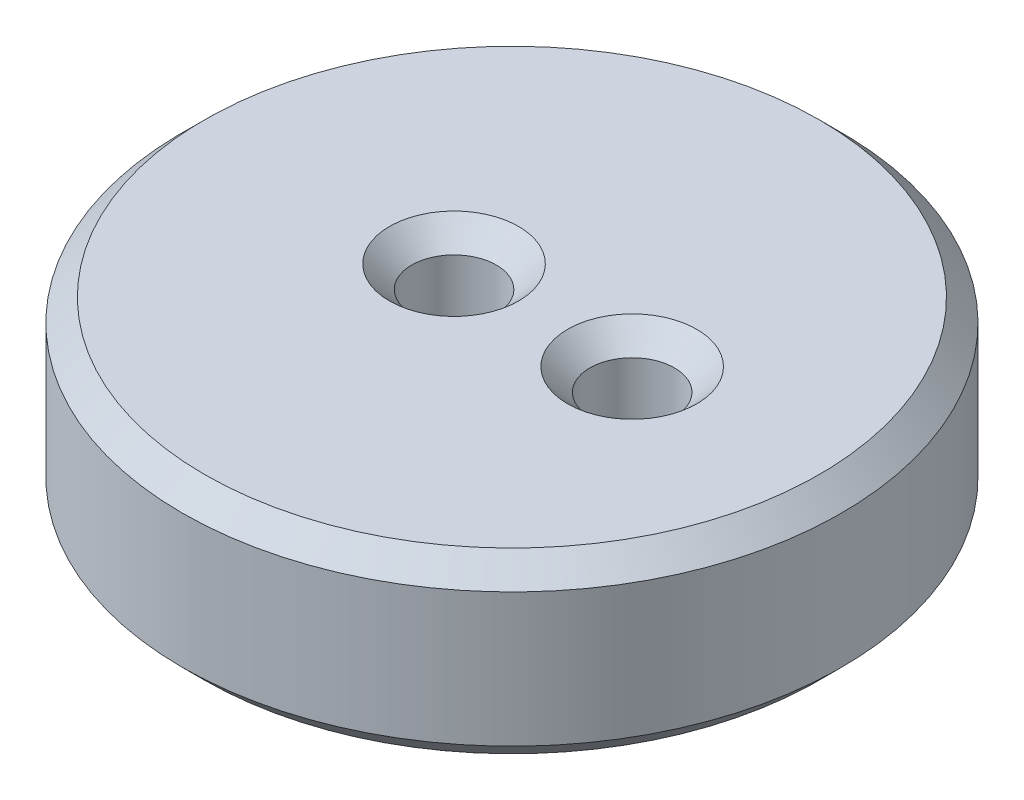
ISO-10303-21;
HEADER;
FILE_DESCRIPTION(('STEP AP214'),'2;1');
FILE_NAME('part.step','',(''),(''),'','','');
FILE_SCHEMA(('AUTOMOTIVE_DESIGN { 1 0 10303 214 1 1 1 1 }'));
ENDSEC;
DATA;
#1=APPLICATION_CONTEXT('core data for automotive mechanical design processes');
#2=APPLICATION_PROTOCOL_DEFINITION('international standard','automotive_design',2000,#1);
#3=PRODUCT_CONTEXT('',#1,'mechanical');
#4=PRODUCT('Part','Part','',(#3));
#5=PRODUCT_RELATED_PRODUCT_CATEGORY('part','',(#4));
#6=PRODUCT_DEFINITION_FORMATION('','',#4);
#7=PRODUCT_DEFINITION_CONTEXT('part definition',#1,'design');
#8=PRODUCT_DEFINITION('design','',#6,#7);
#9=PRODUCT_DEFINITION_SHAPE('','',#8);
#10=(LENGTH_UNIT() NAMED_UNIT(*) SI_UNIT(.MILLI.,.METRE.));
#11=(NAMED_UNIT(*) PLANE_ANGLE_UNIT() SI_UNIT($,.RADIAN.));
#12=(NAMED_UNIT(*) SI_UNIT($,.STERADIAN.) SOLID_ANGLE_UNIT());
#13=UNCERTAINTY_MEASURE_WITH_UNIT(LENGTH_MEASURE(1.E-05),#10,'distance_accuracy_value','');
#14=(GEOMETRIC_REPRESENTATION_CONTEXT(3) GLOBAL_UNCERTAINTY_ASSIGNED_CONTEXT((#13)) GLOBAL_UNIT_ASSIGNED_CONTEXT((#10,
#11,#12)) REPRESENTATION_CONTEXT('',''));
#15=CARTESIAN_POINT('',(0.,0.,0.));
#16=DIRECTION('',(0.,0.,1.));
#17=DIRECTION('',(1.,0.,0.));
#18=AXIS2_PLACEMENT_3D('',#15,#16,#17);
#19=CARTESIAN_POINT('',(0.,4.,0.));
#20=DIRECTION('',(0.,1.,0.));
#21=DIRECTION('',(0.,0.,1.));
#22=AXIS2_PLACEMENT_3D('',#19,#20,#21);
#23=PLANE('',#22);
#24=CARTESIAN_POINT('',(-1.3,4.,0.));
#25=DIRECTION('',(0.,1.,0.));
#26=DIRECTION('',(0.,0.,1.));
#27=AXIS2_PLACEMENT_3D('',#24,#25,#26);
#28=CIRCLE('',#27,1.45000000000001);
#29=CARTESIAN_POINT('',(-1.3,4.,1.45000000000001));
#30=VERTEX_POINT('',#29);
#31=EDGE_CURVE('E10',#30,#30,#28,.F.);
#32=ORIENTED_EDGE('',*,*,#31,.T.);
#33=EDGE_LOOP('',(#32));
#34=FACE_BOUND('',#33,.T.);
#35=CARTESIAN_POINT('',(0.,4.,0.));
#36=DIRECTION('',(0.,1.,0.));
#37=DIRECTION('',(0.,0.,1.));
#38=AXIS2_PLACEMENT_3D('',#35,#36,#37);
#39=CIRCLE('',#38,6.9);
#40=CARTESIAN_POINT('',(0.,4.,6.9));
#41=VERTEX_POINT('',#40);
#42=EDGE_CURVE('E48',#41,#41,#39,.T.);
#43=ORIENTED_EDGE('',*,*,#42,.T.);
#44=EDGE_LOOP('',(#43));
#45=FACE_BOUND('',#44,.T.);
#46=CARTESIAN_POINT('',(2.7,4.,0.));
#47=DIRECTION('',(0.,1.,0.));
#48=DIRECTION('',(0.,0.,1.));
#49=AXIS2_PLACEMENT_3D('',#46,#47,#48);
#50=CIRCLE('',#49,1.45);
#51=CARTESIAN_POINT('',(2.7,4.,1.45));
#52=VERTEX_POINT('',#51);
#53=EDGE_CURVE('E53',#52,#52,#50,.F.);
#54=ORIENTED_EDGE('',*,*,#53,.T.);
#55=EDGE_LOOP('',(#54));
#56=FACE_BOUND('',#55,.T.);
#57=ADVANCED_FACE('F39',(#34,#45,#56),#23,.T.);
#58=CARTESIAN_POINT('',(0.,0.,0.));
#59=DIRECTION('',(0.,1.,0.));
#60=DIRECTION('',(0.,0.,1.));
#61=AXIS2_PLACEMENT_3D('',#58,#59,#60);
#62=PLANE('',#61);
#63=CARTESIAN_POINT('',(-1.3,0.,0.));
#64=DIRECTION('',(0.,1.,0.));
#65=DIRECTION('',(0.,0.,1.));
#66=AXIS2_PLACEMENT_3D('',#63,#64,#65);
#67=CIRCLE('',#66,1.45);
#68=CARTESIAN_POINT('',(-1.3,0.,1.45));
#69=VERTEX_POINT('',#68);
#70=EDGE_CURVE('E84',#69,#69,#67,.T.);
#71=ORIENTED_EDGE('',*,*,#70,.T.);
#72=EDGE_LOOP('',(#71));
#73=FACE_BOUND('',#72,.T.);
#74=CARTESIAN_POINT('',(2.7,0.,0.));
#75=DIRECTION('',(0.,1.,0.));
#76=DIRECTION('',(0.,0.,1.));
#77=AXIS2_PLACEMENT_3D('',#74,#75,#76);
#78=CIRCLE('',#77,1.44999999999999);
#79=CARTESIAN_POINT('',(2.7,0.,1.44999999999999));
#80=VERTEX_POINT('',#79);
#81=EDGE_CURVE('E88',#80,#80,#78,.T.);
#82=ORIENTED_EDGE('',*,*,#81,.T.);
#83=EDGE_LOOP('',(#82));
#84=FACE_BOUND('',#83,.T.);
#85=CARTESIAN_POINT('',(0.,0.,0.));
#86=DIRECTION('',(0.,1.,0.));
#87=DIRECTION('',(0.,0.,1.));
#88=AXIS2_PLACEMENT_3D('',#85,#86,#87);
#89=CIRCLE('',#88,6.9);
#90=CARTESIAN_POINT('',(0.,0.,6.9));
#91=VERTEX_POINT('',#90);
#92=EDGE_CURVE('E92',#91,#91,#89,.F.);
#93=ORIENTED_EDGE('',*,*,#92,.T.);
#94=EDGE_LOOP('',(#93));
#95=FACE_BOUND('',#94,.T.);
#96=ADVANCED_FACE('F97',(#73,#84,#95),#62,.F.);
#97=CARTESIAN_POINT('',(0.,4.,0.));
#98=DIRECTION('',(0.,-1.,0.));
#99=DIRECTION('',(0.,0.,-1.));
#100=AXIS2_PLACEMENT_3D('',#97,#98,#99);
#101=CYLINDRICAL_SURFACE('',#100,7.4);
#102=CARTESIAN_POINT('',(0.,0.5,0.));
#103=DIRECTION('',(0.,1.,0.));
#104=DIRECTION('',(0.,0.,1.));
#105=AXIS2_PLACEMENT_3D('',#102,#103,#104);
#106=CIRCLE('',#105,7.4);
#107=CARTESIAN_POINT('',(0.,0.5,7.4));
#108=VERTEX_POINT('',#107);
#109=EDGE_CURVE('E58',#108,#108,#106,.T.);
#110=ORIENTED_EDGE('',*,*,#109,.T.);
#111=EDGE_LOOP('',(#110));
#112=FACE_BOUND('',#111,.T.);
#113=CARTESIAN_POINT('',(0.,3.5,0.));
#114=DIRECTION('',(0.,1.,0.));
#115=DIRECTION('',(0.,0.,1.));
#116=AXIS2_PLACEMENT_3D('',#113,#114,#115);
#117=CIRCLE('',#116,7.4);
#118=CARTESIAN_POINT('',(0.,3.5,7.4));
#119=VERTEX_POINT('',#118);
#120=EDGE_CURVE('E64',#119,#119,#117,.F.);
#121=ORIENTED_EDGE('',*,*,#120,.T.);
#122=EDGE_LOOP('',(#121));
#123=FACE_BOUND('',#122,.T.);
#124=ADVANCED_FACE('F107',(#112,#123),#101,.T.);
#125=CARTESIAN_POINT('',(2.7,4.,0.));
#126=DIRECTION('',(0.,-1.,0.));
#127=DIRECTION('',(0.,0.,-1.));
#128=AXIS2_PLACEMENT_3D('',#125,#126,#127);
#129=CYLINDRICAL_SURFACE('',#128,0.95);
#130=CARTESIAN_POINT('',(2.7,0.499999999999998,0.));
#131=DIRECTION('',(0.,1.,0.));
#132=DIRECTION('',(0.,0.,1.));
#133=AXIS2_PLACEMENT_3D('',#130,#131,#132);
#134=CIRCLE('',#133,0.95);
#135=CARTESIAN_POINT('',(2.7,0.499999999999998,0.95));
#136=VERTEX_POINT('',#135);
#137=EDGE_CURVE('E68',#136,#136,#134,.F.);
#138=ORIENTED_EDGE('',*,*,#137,.T.);
#139=EDGE_LOOP('',(#138));
#140=FACE_BOUND('',#139,.T.);
#141=CARTESIAN_POINT('',(2.7,3.5,0.));
#142=DIRECTION('',(0.,1.,0.));
#143=DIRECTION('',(0.,0.,1.));
#144=AXIS2_PLACEMENT_3D('',#141,#142,#143);
#145=CIRCLE('',#144,0.95);
#146=CARTESIAN_POINT('',(2.7,3.5,0.95));
#147=VERTEX_POINT('',#146);
#148=EDGE_CURVE('E72',#147,#147,#145,.T.);
#149=ORIENTED_EDGE('',*,*,#148,.T.);
#150=EDGE_LOOP('',(#149));
#151=FACE_BOUND('',#150,.T.);
#152=ADVANCED_FACE('F110',(#140,#151),#129,.F.);
#153=CARTESIAN_POINT('',(-1.3,4.,0.));
#154=DIRECTION('',(0.,-1.,0.));
#155=DIRECTION('',(0.,0.,-1.));
#156=AXIS2_PLACEMENT_3D('',#153,#154,#155);
#157=CYLINDRICAL_SURFACE('',#156,0.95);
#158=CARTESIAN_POINT('',(-1.3,0.500000000000003,0.));
#159=DIRECTION('',(0.,1.,0.));
#160=DIRECTION('',(0.,0.,1.));
#161=AXIS2_PLACEMENT_3D('',#158,#159,#160);
#162=CIRCLE('',#161,0.95);
#163=CARTESIAN_POINT('',(-1.3,0.500000000000003,0.950000000000001));
#164=VERTEX_POINT('',#163);
#165=EDGE_CURVE('E76',#164,#164,#162,.F.);
#166=ORIENTED_EDGE('',*,*,#165,.T.);
#167=EDGE_LOOP('',(#166));
#168=FACE_BOUND('',#167,.T.);
#169=CARTESIAN_POINT('',(-1.3,3.5,0.));
#170=DIRECTION('',(0.,1.,0.));
#171=DIRECTION('',(0.,0.,1.));
#172=AXIS2_PLACEMENT_3D('',#169,#170,#171);
#173=CIRCLE('',#172,0.95);
#174=CARTESIAN_POINT('',(-1.3,3.5,0.950000000000001));
#175=VERTEX_POINT('',#174);
#176=EDGE_CURVE('E80',#175,#175,#173,.T.);
#177=ORIENTED_EDGE('',*,*,#176,.T.);
#178=EDGE_LOOP('',(#177));
#179=FACE_BOUND('',#178,.T.);
#180=ADVANCED_FACE('F142',(#168,#179),#157,.F.);
#181=CARTESIAN_POINT('',(-1.3,0.,0.));
#182=DIRECTION('',(0.,-1.,0.));
#183=DIRECTION('',(0.,0.,-1.));
#184=AXIS2_PLACEMENT_3D('',#181,#182,#183);
#185=CONICAL_SURFACE('',#184,1.45,0.785398163397445);
#186=ORIENTED_EDGE('',*,*,#165,.F.);
#187=EDGE_LOOP('',(#186));
#188=FACE_BOUND('',#187,.T.);
#189=ORIENTED_EDGE('',*,*,#70,.F.);
#190=EDGE_LOOP('',(#189));
#191=FACE_BOUND('',#190,.T.);
#192=ADVANCED_FACE('F136',(#188,#191),#185,.F.);
#193=CARTESIAN_POINT('',(2.7,0.,0.));
#194=DIRECTION('',(0.,-1.,0.));
#195=DIRECTION('',(0.,0.,-1.));
#196=AXIS2_PLACEMENT_3D('',#193,#194,#195);
#197=CONICAL_SURFACE('',#196,1.44999999999999,0.785398163397445);
#198=ORIENTED_EDGE('',*,*,#137,.F.);
#199=EDGE_LOOP('',(#198));
#200=FACE_BOUND('',#199,.T.);
#201=ORIENTED_EDGE('',*,*,#81,.F.);
#202=EDGE_LOOP('',(#201));
#203=FACE_BOUND('',#202,.T.);
#204=ADVANCED_FACE('F103',(#200,#203),#197,.F.);
#205=CARTESIAN_POINT('',(0.,0.5,0.));
#206=DIRECTION('',(0.,1.,0.));
#207=DIRECTION('',(0.,0.,1.));
#208=AXIS2_PLACEMENT_3D('',#205,#206,#207);
#209=CONICAL_SURFACE('',#208,7.4,0.78539816339745);
#210=ORIENTED_EDGE('',*,*,#92,.F.);
#211=EDGE_LOOP('',(#210));
#212=FACE_BOUND('',#211,.T.);
#213=ORIENTED_EDGE('',*,*,#109,.F.);
#214=EDGE_LOOP('',(#213));
#215=FACE_BOUND('',#214,.T.);
#216=ADVANCED_FACE('F99',(#212,#215),#209,.T.);
#217=CARTESIAN_POINT('',(-1.3,3.5,0.));
#218=DIRECTION('',(0.,1.,0.));
#219=DIRECTION('',(0.,0.,1.));
#220=AXIS2_PLACEMENT_3D('',#217,#218,#219);
#221=CONICAL_SURFACE('',#220,0.95,0.785398163397453);
#222=ORIENTED_EDGE('',*,*,#31,.F.);
#223=EDGE_LOOP('',(#222));
#224=FACE_BOUND('',#223,.T.);
#225=ORIENTED_EDGE('',*,*,#176,.F.);
#226=EDGE_LOOP('',(#225));
#227=FACE_BOUND('',#226,.T.);
#228=ADVANCED_FACE('F102',(#224,#227),#221,.F.);
#229=CARTESIAN_POINT('',(0.,4.,0.));
#230=DIRECTION('',(0.,-1.,0.));
#231=DIRECTION('',(0.,0.,-1.));
#232=AXIS2_PLACEMENT_3D('',#229,#230,#231);
#233=CONICAL_SURFACE('',#232,6.9,0.785398163397449);
#234=ORIENTED_EDGE('',*,*,#120,.F.);
#235=EDGE_LOOP('',(#234));
#236=FACE_BOUND('',#235,.T.);
#237=ORIENTED_EDGE('',*,*,#42,.F.);
#238=EDGE_LOOP('',(#237));
#239=FACE_BOUND('',#238,.T.);
#240=ADVANCED_FACE('F114',(#236,#239),#233,.T.);
#241=CARTESIAN_POINT('',(2.7,3.5,0.));
#242=DIRECTION('',(0.,1.,0.));
#243=DIRECTION('',(0.,0.,1.));
#244=AXIS2_PLACEMENT_3D('',#241,#242,#243);
#245=CONICAL_SURFACE('',#244,0.95,0.78539816339745);
#246=ORIENTED_EDGE('',*,*,#53,.F.);
#247=EDGE_LOOP('',(#246));
#248=FACE_BOUND('',#247,.T.);
#249=ORIENTED_EDGE('',*,*,#148,.F.);
#250=EDGE_LOOP('',(#249));
#251=FACE_BOUND('',#250,.T.);
#252=ADVANCED_FACE('F42',(#248,#251),#245,.F.);
#253=CLOSED_SHELL('',(#57,#96,#124,#152,#180,#192,#204,#216,#228,#240,#252));
#254=MANIFOLD_SOLID_BREP('B2',#253);
#255=ADVANCED_BREP_SHAPE_REPRESENTATION('',(#18,#254),#14);
#256=SHAPE_DEFINITION_REPRESENTATION(#9,#255);
ENDSEC;
END-ISO-10303-21;
